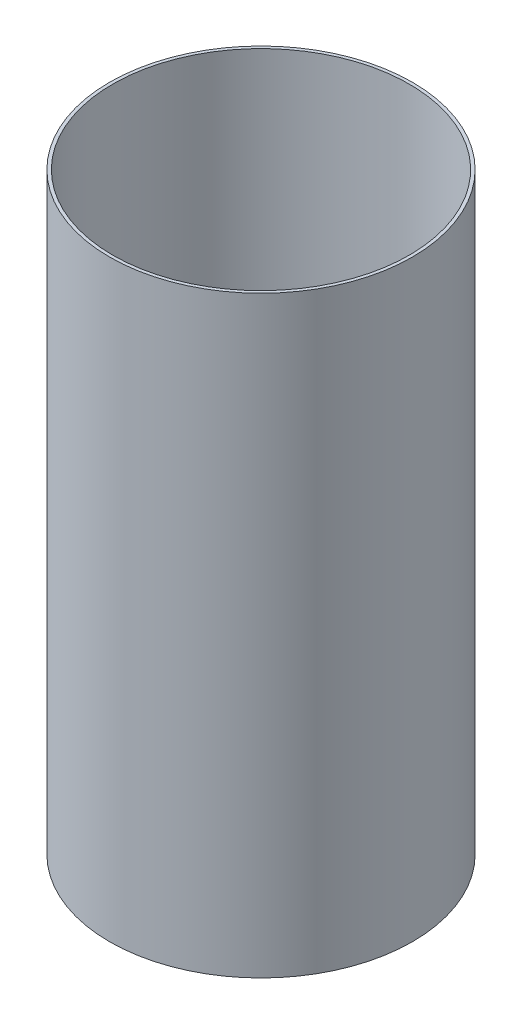
ISO-10303-21;
HEADER;
FILE_DESCRIPTION(('STEP AP214'),'2;1');
FILE_NAME('part.step','',(''),(''),'','','');
FILE_SCHEMA(('AUTOMOTIVE_DESIGN { 1 0 10303 214 1 1 1 1 }'));
ENDSEC;
DATA;
#1=APPLICATION_CONTEXT('core data for automotive mechanical design processes');
#2=APPLICATION_PROTOCOL_DEFINITION('international standard','automotive_design',2000,#1);
#3=PRODUCT_CONTEXT('',#1,'mechanical');
#4=PRODUCT('Part','Part','',(#3));
#5=PRODUCT_RELATED_PRODUCT_CATEGORY('part','',(#4));
#6=PRODUCT_DEFINITION_FORMATION('','',#4);
#7=PRODUCT_DEFINITION_CONTEXT('part definition',#1,'design');
#8=PRODUCT_DEFINITION('design','',#6,#7);
#9=PRODUCT_DEFINITION_SHAPE('','',#8);
#10=(LENGTH_UNIT() NAMED_UNIT(*) SI_UNIT(.MILLI.,.METRE.));
#11=(NAMED_UNIT(*) PLANE_ANGLE_UNIT() SI_UNIT($,.RADIAN.));
#12=(NAMED_UNIT(*) SI_UNIT($,.STERADIAN.) SOLID_ANGLE_UNIT());
#13=UNCERTAINTY_MEASURE_WITH_UNIT(LENGTH_MEASURE(1.E-05),#10,'distance_accuracy_value','');
#14=(GEOMETRIC_REPRESENTATION_CONTEXT(3) GLOBAL_UNCERTAINTY_ASSIGNED_CONTEXT((#13)) GLOBAL_UNIT_ASSIGNED_CONTEXT((#10,
#11,#12)) REPRESENTATION_CONTEXT('',''));
#15=CARTESIAN_POINT('',(0.,0.,0.));
#16=DIRECTION('',(0.,0.,1.));
#17=DIRECTION('',(1.,0.,0.));
#18=AXIS2_PLACEMENT_3D('',#15,#16,#17);
#19=CARTESIAN_POINT('',(0.,149.225,0.));
#20=DIRECTION('',(0.,1.,0.));
#21=DIRECTION('',(0.,0.,1.));
#22=AXIS2_PLACEMENT_3D('',#19,#20,#21);
#23=PLANE('',#22);
#24=CARTESIAN_POINT('',(0.,149.225,0.));
#25=DIRECTION('',(0.,1.,0.));
#26=DIRECTION('',(0.,0.,1.));
#27=AXIS2_PLACEMENT_3D('',#24,#25,#26);
#28=CIRCLE('',#27,76.2);
#29=CARTESIAN_POINT('',(0.,149.225,76.2));
#30=VERTEX_POINT('',#29);
#31=EDGE_CURVE('E10',#30,#30,#28,.T.);
#32=ORIENTED_EDGE('',*,*,#31,.T.);
#33=EDGE_LOOP('',(#32));
#34=FACE_BOUND('',#33,.T.);
#35=CARTESIAN_POINT('',(0.,149.225,0.));
#36=DIRECTION('',(0.,1.,0.));
#37=DIRECTION('',(0.,0.,1.));
#38=AXIS2_PLACEMENT_3D('',#35,#36,#37);
#39=CIRCLE('',#38,74.6125);
#40=CARTESIAN_POINT('',(0.,149.225,74.6125));
#41=VERTEX_POINT('',#40);
#42=EDGE_CURVE('E50',#41,#41,#39,.T.);
#43=ORIENTED_EDGE('',*,*,#42,.F.);
#44=EDGE_LOOP('',(#43));
#45=FACE_BOUND('',#44,.T.);
#46=ADVANCED_FACE('F37',(#34,#45),#23,.T.);
#47=CARTESIAN_POINT('',(0.,-149.225,0.));
#48=DIRECTION('',(0.,1.,0.));
#49=DIRECTION('',(0.,0.,1.));
#50=AXIS2_PLACEMENT_3D('',#47,#48,#49);
#51=PLANE('',#50);
#52=CARTESIAN_POINT('',(0.,-149.225,0.));
#53=DIRECTION('',(0.,1.,0.));
#54=DIRECTION('',(0.,0.,1.));
#55=AXIS2_PLACEMENT_3D('',#52,#53,#54);
#56=CIRCLE('',#55,76.2);
#57=CARTESIAN_POINT('',(0.,-149.225,76.2));
#58=VERTEX_POINT('',#57);
#59=EDGE_CURVE('E41',#58,#58,#56,.T.);
#60=ORIENTED_EDGE('',*,*,#59,.F.);
#61=EDGE_LOOP('',(#60));
#62=FACE_BOUND('',#61,.T.);
#63=CARTESIAN_POINT('',(0.,-149.225,0.));
#64=DIRECTION('',(0.,1.,0.));
#65=DIRECTION('',(0.,0.,1.));
#66=AXIS2_PLACEMENT_3D('',#63,#64,#65);
#67=CIRCLE('',#66,74.6125);
#68=CARTESIAN_POINT('',(0.,-149.225,74.6125));
#69=VERTEX_POINT('',#68);
#70=EDGE_CURVE('E52',#69,#69,#67,.T.);
#71=ORIENTED_EDGE('',*,*,#70,.T.);
#72=EDGE_LOOP('',(#71));
#73=FACE_BOUND('',#72,.T.);
#74=ADVANCED_FACE('F64',(#62,#73),#51,.F.);
#75=CARTESIAN_POINT('',(0.,149.225,0.));
#76=DIRECTION('',(0.,-1.,0.));
#77=DIRECTION('',(0.,0.,-1.));
#78=AXIS2_PLACEMENT_3D('',#75,#76,#77);
#79=CYLINDRICAL_SURFACE('',#78,76.2);
#80=ORIENTED_EDGE('',*,*,#31,.F.);
#81=EDGE_LOOP('',(#80));
#82=FACE_BOUND('',#81,.T.);
#83=ORIENTED_EDGE('',*,*,#59,.T.);
#84=EDGE_LOOP('',(#83));
#85=FACE_BOUND('',#84,.T.);
#86=ADVANCED_FACE('F39',(#82,#85),#79,.T.);
#87=CARTESIAN_POINT('',(0.,149.225,0.));
#88=DIRECTION('',(0.,-1.,0.));
#89=DIRECTION('',(0.,0.,-1.));
#90=AXIS2_PLACEMENT_3D('',#87,#88,#89);
#91=CYLINDRICAL_SURFACE('',#90,74.6125);
#92=ORIENTED_EDGE('',*,*,#42,.T.);
#93=EDGE_LOOP('',(#92));
#94=FACE_BOUND('',#93,.T.);
#95=ORIENTED_EDGE('',*,*,#70,.F.);
#96=EDGE_LOOP('',(#95));
#97=FACE_BOUND('',#96,.T.);
#98=ADVANCED_FACE('F60',(#94,#97),#91,.F.);
#99=CLOSED_SHELL('',(#46,#74,#86,#98));
#100=MANIFOLD_SOLID_BREP('B2',#99);
#101=ADVANCED_BREP_SHAPE_REPRESENTATION('',(#18,#100),#14);
#102=SHAPE_DEFINITION_REPRESENTATION(#9,#101);
ENDSEC;
END-ISO-10303-21;
